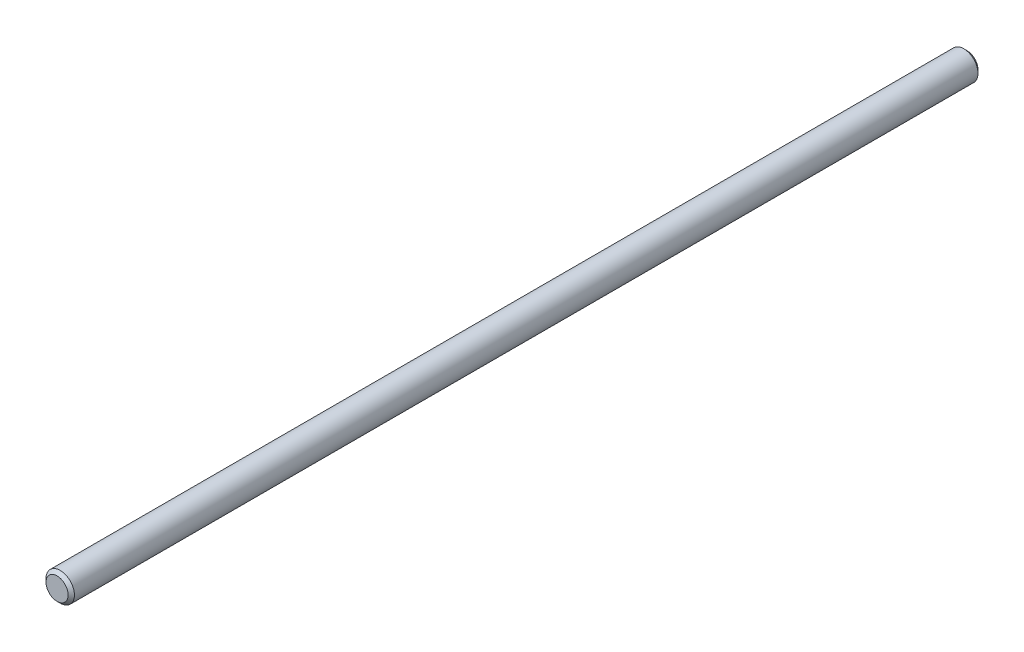
ISO-10303-21;
HEADER;
FILE_DESCRIPTION(('STEP AP214'),'2;1');
FILE_NAME('part.step','',(''),(''),'','','');
FILE_SCHEMA(('AUTOMOTIVE_DESIGN { 1 0 10303 214 1 1 1 1 }'));
ENDSEC;
DATA;
#1=APPLICATION_CONTEXT('core data for automotive mechanical design processes');
#2=APPLICATION_PROTOCOL_DEFINITION('international standard','automotive_design',2000,#1);
#3=PRODUCT_CONTEXT('',#1,'mechanical');
#4=PRODUCT('Part','Part','',(#3));
#5=PRODUCT_RELATED_PRODUCT_CATEGORY('part','',(#4));
#6=PRODUCT_DEFINITION_FORMATION('','',#4);
#7=PRODUCT_DEFINITION_CONTEXT('part definition',#1,'design');
#8=PRODUCT_DEFINITION('design','',#6,#7);
#9=PRODUCT_DEFINITION_SHAPE('','',#8);
#10=(LENGTH_UNIT() NAMED_UNIT(*) SI_UNIT(.MILLI.,.METRE.));
#11=(NAMED_UNIT(*) PLANE_ANGLE_UNIT() SI_UNIT($,.RADIAN.));
#12=(NAMED_UNIT(*) SI_UNIT($,.STERADIAN.) SOLID_ANGLE_UNIT());
#13=UNCERTAINTY_MEASURE_WITH_UNIT(LENGTH_MEASURE(1.E-05),#10,'distance_accuracy_value','');
#14=(GEOMETRIC_REPRESENTATION_CONTEXT(3) GLOBAL_UNCERTAINTY_ASSIGNED_CONTEXT((#13)) GLOBAL_UNIT_ASSIGNED_CONTEXT((#10,
#11,#12)) REPRESENTATION_CONTEXT('',''));
#15=CARTESIAN_POINT('',(0.,0.,0.));
#16=DIRECTION('',(0.,0.,1.));
#17=DIRECTION('',(1.,0.,0.));
#18=AXIS2_PLACEMENT_3D('',#15,#16,#17);
#19=CARTESIAN_POINT('',(0.,3.70416666666667,152.4));
#20=DIRECTION('',(0.,0.,-1.));
#21=DIRECTION('',(-1.,0.,0.));
#22=AXIS2_PLACEMENT_3D('',#19,#20,#21);
#23=PLANE('',#22);
#24=CARTESIAN_POINT('',(0.,0.,152.4));
#25=DIRECTION('',(0.,0.,1.));
#26=DIRECTION('',(1.,0.,0.));
#27=AXIS2_PLACEMENT_3D('',#24,#25,#26);
#28=CIRCLE('',#27,3.70416666666667);
#29=CARTESIAN_POINT('',(3.70416666666667,0.,152.4));
#30=VERTEX_POINT('',#29);
#31=EDGE_CURVE('E50',#30,#30,#28,.T.);
#32=ORIENTED_EDGE('',*,*,#31,.T.);
#33=EDGE_LOOP('',(#32));
#34=FACE_BOUND('',#33,.T.);
#35=ADVANCED_FACE('F36',(#34),#23,.F.);
#36=CARTESIAN_POINT('',(0.,0.,-152.4));
#37=DIRECTION('',(0.,0.,1.));
#38=DIRECTION('',(1.,0.,0.));
#39=AXIS2_PLACEMENT_3D('',#36,#37,#38);
#40=PLANE('',#39);
#41=CARTESIAN_POINT('',(0.,0.,-152.4));
#42=DIRECTION('',(0.,0.,1.));
#43=DIRECTION('',(1.,0.,0.));
#44=AXIS2_PLACEMENT_3D('',#41,#42,#43);
#45=CIRCLE('',#44,3.70416666666662);
#46=CARTESIAN_POINT('',(3.70416666666662,0.,-152.4));
#47=VERTEX_POINT('',#46);
#48=EDGE_CURVE('E10',#47,#47,#45,.T.);
#49=ORIENTED_EDGE('',*,*,#48,.F.);
#50=EDGE_LOOP('',(#49));
#51=FACE_BOUND('',#50,.T.);
#52=ADVANCED_FACE('F70',(#51),#40,.F.);
#53=CARTESIAN_POINT('',(0.,0.,-152.4));
#54=DIRECTION('',(0.,0.,1.));
#55=DIRECTION('',(1.,0.,0.));
#56=AXIS2_PLACEMENT_3D('',#53,#54,#55);
#57=CONICAL_SURFACE('',#56,3.70416666666662,0.785398163397447);
#58=CARTESIAN_POINT('',(0.,0.,-151.341666666667));
#59=DIRECTION('',(0.,0.,1.));
#60=DIRECTION('',(1.,0.,0.));
#61=AXIS2_PLACEMENT_3D('',#58,#59,#60);
#62=CIRCLE('',#61,4.7625);
#63=CARTESIAN_POINT('',(4.7625,0.,-151.341666666667));
#64=VERTEX_POINT('',#63);
#65=EDGE_CURVE('E42',#64,#64,#62,.T.);
#66=ORIENTED_EDGE('',*,*,#65,.F.);
#67=EDGE_LOOP('',(#66));
#68=FACE_BOUND('',#67,.T.);
#69=ORIENTED_EDGE('',*,*,#48,.T.);
#70=EDGE_LOOP('',(#69));
#71=FACE_BOUND('',#70,.T.);
#72=ADVANCED_FACE('F65',(#68,#71),#57,.T.);
#73=CARTESIAN_POINT('',(0.,0.,152.4));
#74=DIRECTION('',(0.,0.,1.));
#75=DIRECTION('',(1.,0.,0.));
#76=AXIS2_PLACEMENT_3D('',#73,#74,#75);
#77=CYLINDRICAL_SURFACE('',#76,4.76249999999998);
#78=CARTESIAN_POINT('',(0.,0.,151.341666666667));
#79=DIRECTION('',(0.,0.,1.));
#80=DIRECTION('',(1.,0.,0.));
#81=AXIS2_PLACEMENT_3D('',#78,#79,#80);
#82=CIRCLE('',#81,4.76249999999996);
#83=CARTESIAN_POINT('',(4.76249999999996,0.,151.341666666667));
#84=VERTEX_POINT('',#83);
#85=EDGE_CURVE('E46',#84,#84,#82,.T.);
#86=ORIENTED_EDGE('',*,*,#85,.F.);
#87=EDGE_LOOP('',(#86));
#88=FACE_BOUND('',#87,.T.);
#89=ORIENTED_EDGE('',*,*,#65,.T.);
#90=EDGE_LOOP('',(#89));
#91=FACE_BOUND('',#90,.T.);
#92=ADVANCED_FACE('F60',(#88,#91),#77,.T.);
#93=CARTESIAN_POINT('',(0.,0.,151.341666666667));
#94=DIRECTION('',(0.,0.,-1.));
#95=DIRECTION('',(-1.,0.,0.));
#96=AXIS2_PLACEMENT_3D('',#93,#94,#95);
#97=CONICAL_SURFACE('',#96,4.76249999999996,0.785398163397434);
#98=ORIENTED_EDGE('',*,*,#31,.F.);
#99=EDGE_LOOP('',(#98));
#100=FACE_BOUND('',#99,.T.);
#101=ORIENTED_EDGE('',*,*,#85,.T.);
#102=EDGE_LOOP('',(#101));
#103=FACE_BOUND('',#102,.T.);
#104=ADVANCED_FACE('F57',(#100,#103),#97,.T.);
#105=CLOSED_SHELL('',(#35,#52,#72,#92,#104));
#106=MANIFOLD_SOLID_BREP('B2',#105);
#107=ADVANCED_BREP_SHAPE_REPRESENTATION('',(#18,#106),#14);
#108=SHAPE_DEFINITION_REPRESENTATION(#9,#107);
ENDSEC;
END-ISO-10303-21;
